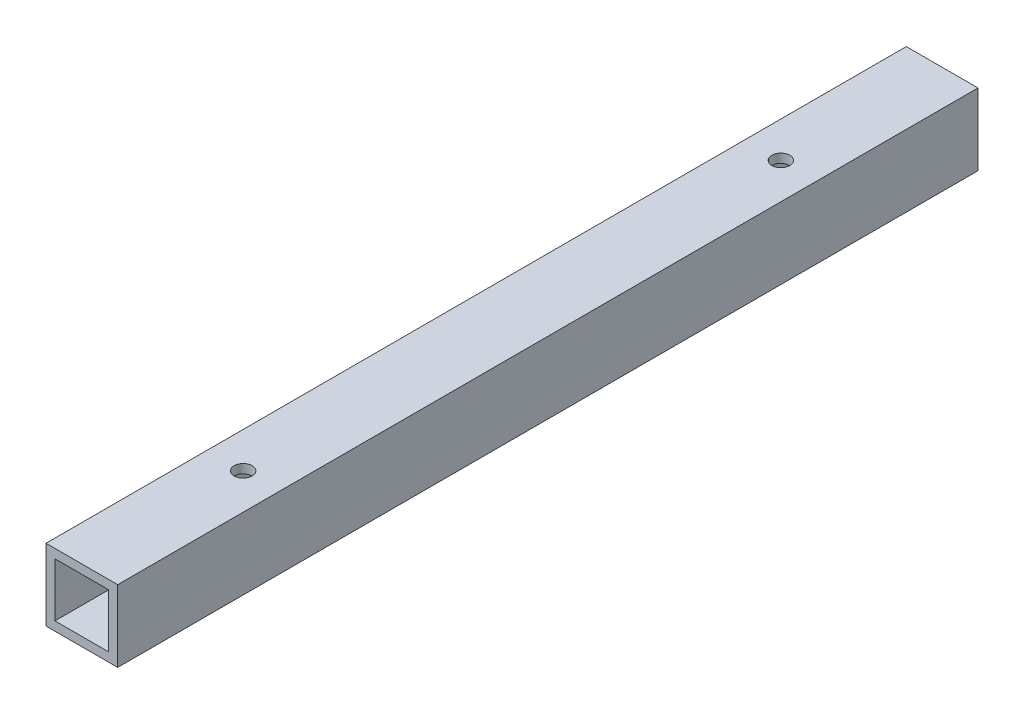
ISO-10303-21;
HEADER;
FILE_DESCRIPTION(('STEP AP214'),'2;1');
FILE_NAME('part.step','',(''),(''),'','','');
FILE_SCHEMA(('AUTOMOTIVE_DESIGN { 1 0 10303 214 1 1 1 1 }'));
ENDSEC;
DATA;
#1=APPLICATION_CONTEXT('core data for automotive mechanical design processes');
#2=APPLICATION_PROTOCOL_DEFINITION('international standard','automotive_design',2000,#1);
#3=PRODUCT_CONTEXT('',#1,'mechanical');
#4=PRODUCT('Part','Part','',(#3));
#5=PRODUCT_RELATED_PRODUCT_CATEGORY('part','',(#4));
#6=PRODUCT_DEFINITION_FORMATION('','',#4);
#7=PRODUCT_DEFINITION_CONTEXT('part definition',#1,'design');
#8=PRODUCT_DEFINITION('design','',#6,#7);
#9=PRODUCT_DEFINITION_SHAPE('','',#8);
#10=(LENGTH_UNIT() NAMED_UNIT(*) SI_UNIT(.MILLI.,.METRE.));
#11=(NAMED_UNIT(*) PLANE_ANGLE_UNIT() SI_UNIT($,.RADIAN.));
#12=(NAMED_UNIT(*) SI_UNIT($,.STERADIAN.) SOLID_ANGLE_UNIT());
#13=UNCERTAINTY_MEASURE_WITH_UNIT(LENGTH_MEASURE(1.E-05),#10,'distance_accuracy_value','');
#14=(GEOMETRIC_REPRESENTATION_CONTEXT(3) GLOBAL_UNCERTAINTY_ASSIGNED_CONTEXT((#13)) GLOBAL_UNIT_ASSIGNED_CONTEXT((#10,
#11,#12)) REPRESENTATION_CONTEXT('',''));
#15=CARTESIAN_POINT('',(0.,0.,0.));
#16=DIRECTION('',(0.,0.,1.));
#17=DIRECTION('',(1.,0.,0.));
#18=AXIS2_PLACEMENT_3D('',#15,#16,#17);
#19=CARTESIAN_POINT('',(0.,0.,152.4));
#20=DIRECTION('',(0.,0.,1.));
#21=DIRECTION('',(1.,0.,0.));
#22=AXIS2_PLACEMENT_3D('',#19,#20,#21);
#23=PLANE('',#22);
#24=DIRECTION('',(0.,-1.,0.));
#25=VECTOR('',#24,1.);
#26=CARTESIAN_POINT('',(-12.7,-12.7,152.4));
#27=LINE('',#26,#25);
#28=CARTESIAN_POINT('',(-12.7,12.7,152.4));
#29=VERTEX_POINT('',#28);
#30=CARTESIAN_POINT('',(-12.7,-12.7,152.4));
#31=VERTEX_POINT('',#30);
#32=EDGE_CURVE('E119',#29,#31,#27,.T.);
#33=ORIENTED_EDGE('',*,*,#32,.T.);
#34=DIRECTION('',(1.,0.,0.));
#35=VECTOR('',#34,1.);
#36=CARTESIAN_POINT('',(12.7,-12.7,152.4));
#37=LINE('',#36,#35);
#38=CARTESIAN_POINT('',(12.7,-12.7,152.4));
#39=VERTEX_POINT('',#38);
#40=EDGE_CURVE('E183',#31,#39,#37,.T.);
#41=ORIENTED_EDGE('',*,*,#40,.T.);
#42=DIRECTION('',(0.,1.,0.));
#43=VECTOR('',#42,1.);
#44=CARTESIAN_POINT('',(12.7,-12.7,152.4));
#45=LINE('',#44,#43);
#46=CARTESIAN_POINT('',(12.7,12.7,152.4));
#47=VERTEX_POINT('',#46);
#48=EDGE_CURVE('E186',#39,#47,#45,.T.);
#49=ORIENTED_EDGE('',*,*,#48,.T.);
#50=DIRECTION('',(-1.,0.,0.));
#51=VECTOR('',#50,1.);
#52=CARTESIAN_POINT('',(12.7,12.7,152.4));
#53=LINE('',#52,#51);
#54=EDGE_CURVE('E65',#47,#29,#53,.T.);
#55=ORIENTED_EDGE('',*,*,#54,.T.);
#56=EDGE_LOOP('',(#33,#41,#49,#55));
#57=FACE_BOUND('',#56,.T.);
#58=DIRECTION('',(1.,0.,0.));
#59=VECTOR('',#58,1.);
#60=CARTESIAN_POINT('',(9.525,-9.525,152.4));
#61=LINE('',#60,#59);
#62=CARTESIAN_POINT('',(-9.52499999999999,-9.525,152.4));
#63=VERTEX_POINT('',#62);
#64=CARTESIAN_POINT('',(9.525,-9.525,152.4));
#65=VERTEX_POINT('',#64);
#66=EDGE_CURVE('E165',#63,#65,#61,.T.);
#67=ORIENTED_EDGE('',*,*,#66,.F.);
#68=DIRECTION('',(0.,-1.,0.));
#69=VECTOR('',#68,1.);
#70=CARTESIAN_POINT('',(-9.52499999999999,-9.525,152.4));
#71=LINE('',#70,#69);
#72=CARTESIAN_POINT('',(-9.52499999999999,9.525,152.4));
#73=VERTEX_POINT('',#72);
#74=EDGE_CURVE('E115',#73,#63,#71,.T.);
#75=ORIENTED_EDGE('',*,*,#74,.F.);
#76=DIRECTION('',(-1.,0.,0.));
#77=VECTOR('',#76,1.);
#78=CARTESIAN_POINT('',(9.525,9.525,152.4));
#79=LINE('',#78,#77);
#80=CARTESIAN_POINT('',(9.525,9.525,152.4));
#81=VERTEX_POINT('',#80);
#82=EDGE_CURVE('E171',#81,#73,#79,.T.);
#83=ORIENTED_EDGE('',*,*,#82,.F.);
#84=DIRECTION('',(0.,1.,0.));
#85=VECTOR('',#84,1.);
#86=CARTESIAN_POINT('',(9.525,-9.525,152.4));
#87=LINE('',#86,#85);
#88=EDGE_CURVE('E168',#65,#81,#87,.T.);
#89=ORIENTED_EDGE('',*,*,#88,.F.);
#90=EDGE_LOOP('',(#67,#75,#83,#89));
#91=FACE_BOUND('',#90,.T.);
#92=ADVANCED_FACE('F39',(#57,#91),#23,.T.);
#93=CARTESIAN_POINT('',(-12.7,-12.7,152.4));
#94=DIRECTION('',(1.,0.,0.));
#95=DIRECTION('',(0.,0.,-1.));
#96=AXIS2_PLACEMENT_3D('',#93,#94,#95);
#97=PLANE('',#96);
#98=DIRECTION('',(0.,0.,-1.));
#99=VECTOR('',#98,1.);
#100=CARTESIAN_POINT('',(-12.7,12.7,152.4));
#101=LINE('',#100,#99);
#102=CARTESIAN_POINT('',(-12.7,12.7,-152.4));
#103=VERTEX_POINT('',#102);
#104=EDGE_CURVE('E191',#29,#103,#101,.T.);
#105=ORIENTED_EDGE('',*,*,#104,.T.);
#106=DIRECTION('',(0.,-1.,0.));
#107=VECTOR('',#106,1.);
#108=CARTESIAN_POINT('',(-12.7,-12.7,-152.4));
#109=LINE('',#108,#107);
#110=CARTESIAN_POINT('',(-12.7,-12.7,-152.4));
#111=VERTEX_POINT('',#110);
#112=EDGE_CURVE('E147',#103,#111,#109,.T.);
#113=ORIENTED_EDGE('',*,*,#112,.T.);
#114=DIRECTION('',(0.,0.,-1.));
#115=VECTOR('',#114,1.);
#116=CARTESIAN_POINT('',(-12.7,-12.7,152.4));
#117=LINE('',#116,#115);
#118=EDGE_CURVE('E11',#31,#111,#117,.T.);
#119=ORIENTED_EDGE('',*,*,#118,.F.);
#120=ORIENTED_EDGE('',*,*,#32,.F.);
#121=EDGE_LOOP('',(#105,#113,#119,#120));
#122=FACE_BOUND('',#121,.T.);
#123=ADVANCED_FACE('F41',(#122),#97,.F.);
#124=CARTESIAN_POINT('',(12.7,-12.7,152.4));
#125=DIRECTION('',(0.,1.,0.));
#126=DIRECTION('',(0.,0.,1.));
#127=AXIS2_PLACEMENT_3D('',#124,#125,#126);
#128=PLANE('',#127);
#129=CARTESIAN_POINT('',(0.,-12.7,95.25));
#130=DIRECTION('',(0.,1.,0.));
#131=DIRECTION('',(0.,0.,1.));
#132=AXIS2_PLACEMENT_3D('',#129,#130,#131);
#133=CIRCLE('',#132,3.175);
#134=CARTESIAN_POINT('',(0.,-12.7,98.425));
#135=VERTEX_POINT('',#134);
#136=EDGE_CURVE('E202',#135,#135,#133,.T.);
#137=ORIENTED_EDGE('',*,*,#136,.T.);
#138=EDGE_LOOP('',(#137));
#139=FACE_BOUND('',#138,.T.);
#140=CARTESIAN_POINT('',(0.,-12.7,-95.2499999999999));
#141=DIRECTION('',(0.,1.,0.));
#142=DIRECTION('',(0.,0.,-1.));
#143=AXIS2_PLACEMENT_3D('',#140,#141,#142);
#144=CIRCLE('',#143,3.175);
#145=CARTESIAN_POINT('',(0.,-12.7,-98.4249999999999));
#146=VERTEX_POINT('',#145);
#147=EDGE_CURVE('E215',#146,#146,#144,.T.);
#148=ORIENTED_EDGE('',*,*,#147,.T.);
#149=EDGE_LOOP('',(#148));
#150=FACE_BOUND('',#149,.T.);
#151=ORIENTED_EDGE('',*,*,#118,.T.);
#152=DIRECTION('',(1.,0.,0.));
#153=VECTOR('',#152,1.);
#154=CARTESIAN_POINT('',(12.7,-12.7,-152.4));
#155=LINE('',#154,#153);
#156=CARTESIAN_POINT('',(12.7,-12.7,-152.4));
#157=VERTEX_POINT('',#156);
#158=EDGE_CURVE('E151',#111,#157,#155,.T.);
#159=ORIENTED_EDGE('',*,*,#158,.T.);
#160=DIRECTION('',(0.,0.,-1.));
#161=VECTOR('',#160,1.);
#162=CARTESIAN_POINT('',(12.7,-12.7,152.4));
#163=LINE('',#162,#161);
#164=EDGE_CURVE('E49',#39,#157,#163,.T.);
#165=ORIENTED_EDGE('',*,*,#164,.F.);
#166=ORIENTED_EDGE('',*,*,#40,.F.);
#167=EDGE_LOOP('',(#151,#159,#165,#166));
#168=FACE_BOUND('',#167,.T.);
#169=ADVANCED_FACE('F247',(#139,#150,#168),#128,.F.);
#170=CARTESIAN_POINT('',(12.7,-12.7,152.4));
#171=DIRECTION('',(-1.,0.,0.));
#172=DIRECTION('',(0.,0.,1.));
#173=AXIS2_PLACEMENT_3D('',#170,#171,#172);
#174=PLANE('',#173);
#175=ORIENTED_EDGE('',*,*,#164,.T.);
#176=DIRECTION('',(0.,1.,0.));
#177=VECTOR('',#176,1.);
#178=CARTESIAN_POINT('',(12.7,-12.7,-152.4));
#179=LINE('',#178,#177);
#180=CARTESIAN_POINT('',(12.7,12.7,-152.4));
#181=VERTEX_POINT('',#180);
#182=EDGE_CURVE('E155',#157,#181,#179,.T.);
#183=ORIENTED_EDGE('',*,*,#182,.T.);
#184=DIRECTION('',(0.,0.,-1.));
#185=VECTOR('',#184,1.);
#186=CARTESIAN_POINT('',(12.7,12.7,152.4));
#187=LINE('',#186,#185);
#188=EDGE_CURVE('E194',#47,#181,#187,.T.);
#189=ORIENTED_EDGE('',*,*,#188,.F.);
#190=ORIENTED_EDGE('',*,*,#48,.F.);
#191=EDGE_LOOP('',(#175,#183,#189,#190));
#192=FACE_BOUND('',#191,.T.);
#193=ADVANCED_FACE('F231',(#192),#174,.F.);
#194=CARTESIAN_POINT('',(12.7,12.7,152.4));
#195=DIRECTION('',(0.,-1.,0.));
#196=DIRECTION('',(0.,0.,-1.));
#197=AXIS2_PLACEMENT_3D('',#194,#195,#196);
#198=PLANE('',#197);
#199=CARTESIAN_POINT('',(0.,12.7,95.25));
#200=DIRECTION('',(0.,1.,0.));
#201=DIRECTION('',(0.,0.,1.));
#202=AXIS2_PLACEMENT_3D('',#199,#200,#201);
#203=CIRCLE('',#202,3.175);
#204=CARTESIAN_POINT('',(0.,12.7,98.425));
#205=VERTEX_POINT('',#204);
#206=EDGE_CURVE('E209',#205,#205,#203,.T.);
#207=ORIENTED_EDGE('',*,*,#206,.F.);
#208=EDGE_LOOP('',(#207));
#209=FACE_BOUND('',#208,.T.);
#210=CARTESIAN_POINT('',(0.,12.7,-95.2499999999999));
#211=DIRECTION('',(0.,1.,0.));
#212=DIRECTION('',(0.,0.,-1.));
#213=AXIS2_PLACEMENT_3D('',#210,#211,#212);
#214=CIRCLE('',#213,3.175);
#215=CARTESIAN_POINT('',(0.,12.7,-98.4249999999999));
#216=VERTEX_POINT('',#215);
#217=EDGE_CURVE('E221',#216,#216,#214,.T.);
#218=ORIENTED_EDGE('',*,*,#217,.F.);
#219=EDGE_LOOP('',(#218));
#220=FACE_BOUND('',#219,.T.);
#221=ORIENTED_EDGE('',*,*,#188,.T.);
#222=DIRECTION('',(-1.,0.,0.));
#223=VECTOR('',#222,1.);
#224=CARTESIAN_POINT('',(12.7,12.7,-152.4));
#225=LINE('',#224,#223);
#226=EDGE_CURVE('E159',#181,#103,#225,.T.);
#227=ORIENTED_EDGE('',*,*,#226,.T.);
#228=ORIENTED_EDGE('',*,*,#104,.F.);
#229=ORIENTED_EDGE('',*,*,#54,.F.);
#230=EDGE_LOOP('',(#221,#227,#228,#229));
#231=FACE_BOUND('',#230,.T.);
#232=ADVANCED_FACE('F228',(#209,#220,#231),#198,.F.);
#233=CARTESIAN_POINT('',(-9.52499999999999,-9.525,152.4));
#234=DIRECTION('',(1.,0.,0.));
#235=DIRECTION('',(0.,0.,-1.));
#236=AXIS2_PLACEMENT_3D('',#233,#234,#235);
#237=PLANE('',#236);
#238=DIRECTION('',(0.,0.,-1.));
#239=VECTOR('',#238,1.);
#240=CARTESIAN_POINT('',(-9.52499999999999,-9.525,152.4));
#241=LINE('',#240,#239);
#242=CARTESIAN_POINT('',(-9.52499999999999,-9.525,-152.4));
#243=VERTEX_POINT('',#242);
#244=EDGE_CURVE('E107',#63,#243,#241,.T.);
#245=ORIENTED_EDGE('',*,*,#244,.T.);
#246=DIRECTION('',(0.,-1.,0.));
#247=VECTOR('',#246,1.);
#248=CARTESIAN_POINT('',(-9.52499999999999,-9.525,-152.4));
#249=LINE('',#248,#247);
#250=CARTESIAN_POINT('',(-9.52499999999999,9.525,-152.4));
#251=VERTEX_POINT('',#250);
#252=EDGE_CURVE('E112',#251,#243,#249,.T.);
#253=ORIENTED_EDGE('',*,*,#252,.F.);
#254=DIRECTION('',(0.,0.,-1.));
#255=VECTOR('',#254,1.);
#256=CARTESIAN_POINT('',(-9.52499999999999,9.525,152.4));
#257=LINE('',#256,#255);
#258=EDGE_CURVE('E174',#73,#251,#257,.T.);
#259=ORIENTED_EDGE('',*,*,#258,.F.);
#260=ORIENTED_EDGE('',*,*,#74,.T.);
#261=EDGE_LOOP('',(#245,#253,#259,#260));
#262=FACE_BOUND('',#261,.T.);
#263=ADVANCED_FACE('F109',(#262),#237,.T.);
#264=CARTESIAN_POINT('',(9.525,-9.525,152.4));
#265=DIRECTION('',(0.,1.,0.));
#266=DIRECTION('',(0.,0.,1.));
#267=AXIS2_PLACEMENT_3D('',#264,#265,#266);
#268=PLANE('',#267);
#269=CARTESIAN_POINT('',(0.,-9.525,95.25));
#270=DIRECTION('',(0.,1.,0.));
#271=DIRECTION('',(0.,0.,1.));
#272=AXIS2_PLACEMENT_3D('',#269,#270,#271);
#273=CIRCLE('',#272,3.175);
#274=CARTESIAN_POINT('',(0.,-9.525,98.425));
#275=VERTEX_POINT('',#274);
#276=EDGE_CURVE('E136',#275,#275,#273,.T.);
#277=ORIENTED_EDGE('',*,*,#276,.F.);
#278=EDGE_LOOP('',(#277));
#279=FACE_BOUND('',#278,.T.);
#280=CARTESIAN_POINT('',(0.,-9.525,-95.2499999999999));
#281=DIRECTION('',(0.,1.,0.));
#282=DIRECTION('',(0.,0.,1.));
#283=AXIS2_PLACEMENT_3D('',#280,#281,#282);
#284=CIRCLE('',#283,3.175);
#285=CARTESIAN_POINT('',(0.,-9.525,-92.0749999999999));
#286=VERTEX_POINT('',#285);
#287=EDGE_CURVE('E201',#286,#286,#284,.T.);
#288=ORIENTED_EDGE('',*,*,#287,.F.);
#289=EDGE_LOOP('',(#288));
#290=FACE_BOUND('',#289,.T.);
#291=DIRECTION('',(0.,0.,-1.));
#292=VECTOR('',#291,1.);
#293=CARTESIAN_POINT('',(9.525,-9.525,152.4));
#294=LINE('',#293,#292);
#295=CARTESIAN_POINT('',(9.525,-9.525,-152.4));
#296=VERTEX_POINT('',#295);
#297=EDGE_CURVE('E120',#65,#296,#294,.T.);
#298=ORIENTED_EDGE('',*,*,#297,.T.);
#299=DIRECTION('',(1.,0.,0.));
#300=VECTOR('',#299,1.);
#301=CARTESIAN_POINT('',(9.525,-9.525,-152.4));
#302=LINE('',#301,#300);
#303=EDGE_CURVE('E123',#243,#296,#302,.T.);
#304=ORIENTED_EDGE('',*,*,#303,.F.);
#305=ORIENTED_EDGE('',*,*,#244,.F.);
#306=ORIENTED_EDGE('',*,*,#66,.T.);
#307=EDGE_LOOP('',(#298,#304,#305,#306));
#308=FACE_BOUND('',#307,.T.);
#309=ADVANCED_FACE('F124',(#279,#290,#308),#268,.T.);
#310=CARTESIAN_POINT('',(9.525,-9.525,152.4));
#311=DIRECTION('',(-1.,0.,0.));
#312=DIRECTION('',(0.,0.,1.));
#313=AXIS2_PLACEMENT_3D('',#310,#311,#312);
#314=PLANE('',#313);
#315=DIRECTION('',(0.,0.,-1.));
#316=VECTOR('',#315,1.);
#317=CARTESIAN_POINT('',(9.525,9.525,152.4));
#318=LINE('',#317,#316);
#319=CARTESIAN_POINT('',(9.525,9.525,-152.4));
#320=VERTEX_POINT('',#319);
#321=EDGE_CURVE('E57',#81,#320,#318,.T.);
#322=ORIENTED_EDGE('',*,*,#321,.T.);
#323=DIRECTION('',(0.,1.,0.));
#324=VECTOR('',#323,1.);
#325=CARTESIAN_POINT('',(9.525,-9.525,-152.4));
#326=LINE('',#325,#324);
#327=EDGE_CURVE('E130',#296,#320,#326,.T.);
#328=ORIENTED_EDGE('',*,*,#327,.F.);
#329=ORIENTED_EDGE('',*,*,#297,.F.);
#330=ORIENTED_EDGE('',*,*,#88,.T.);
#331=EDGE_LOOP('',(#322,#328,#329,#330));
#332=FACE_BOUND('',#331,.T.);
#333=ADVANCED_FACE('F264',(#332),#314,.T.);
#334=CARTESIAN_POINT('',(9.525,9.525,152.4));
#335=DIRECTION('',(0.,-1.,0.));
#336=DIRECTION('',(0.,0.,-1.));
#337=AXIS2_PLACEMENT_3D('',#334,#335,#336);
#338=PLANE('',#337);
#339=CARTESIAN_POINT('',(0.,9.525,95.25));
#340=DIRECTION('',(0.,-1.,0.));
#341=DIRECTION('',(0.,0.,-1.));
#342=AXIS2_PLACEMENT_3D('',#339,#340,#341);
#343=CIRCLE('',#342,3.175);
#344=CARTESIAN_POINT('',(0.,9.525,92.075));
#345=VERTEX_POINT('',#344);
#346=EDGE_CURVE('E43',#345,#345,#343,.T.);
#347=ORIENTED_EDGE('',*,*,#346,.F.);
#348=EDGE_LOOP('',(#347));
#349=FACE_BOUND('',#348,.T.);
#350=CARTESIAN_POINT('',(0.,9.525,-95.2499999999999));
#351=DIRECTION('',(0.,-1.,0.));
#352=DIRECTION('',(0.,0.,-1.));
#353=AXIS2_PLACEMENT_3D('',#350,#351,#352);
#354=CIRCLE('',#353,3.175);
#355=CARTESIAN_POINT('',(0.,9.525,-98.4249999999999));
#356=VERTEX_POINT('',#355);
#357=EDGE_CURVE('E198',#356,#356,#354,.T.);
#358=ORIENTED_EDGE('',*,*,#357,.F.);
#359=EDGE_LOOP('',(#358));
#360=FACE_BOUND('',#359,.T.);
#361=ORIENTED_EDGE('',*,*,#258,.T.);
#362=DIRECTION('',(-1.,0.,0.));
#363=VECTOR('',#362,1.);
#364=CARTESIAN_POINT('',(9.525,9.525,-152.4));
#365=LINE('',#364,#363);
#366=EDGE_CURVE('E134',#320,#251,#365,.T.);
#367=ORIENTED_EDGE('',*,*,#366,.F.);
#368=ORIENTED_EDGE('',*,*,#321,.F.);
#369=ORIENTED_EDGE('',*,*,#82,.T.);
#370=EDGE_LOOP('',(#361,#367,#368,#369));
#371=FACE_BOUND('',#370,.T.);
#372=ADVANCED_FACE('F268',(#349,#360,#371),#338,.T.);
#373=CARTESIAN_POINT('',(0.,0.,-152.4));
#374=DIRECTION('',(0.,0.,1.));
#375=DIRECTION('',(1.,0.,0.));
#376=AXIS2_PLACEMENT_3D('',#373,#374,#375);
#377=PLANE('',#376);
#378=ORIENTED_EDGE('',*,*,#366,.T.);
#379=ORIENTED_EDGE('',*,*,#252,.T.);
#380=ORIENTED_EDGE('',*,*,#303,.T.);
#381=ORIENTED_EDGE('',*,*,#327,.T.);
#382=EDGE_LOOP('',(#378,#379,#380,#381));
#383=FACE_BOUND('',#382,.T.);
#384=ORIENTED_EDGE('',*,*,#112,.F.);
#385=ORIENTED_EDGE('',*,*,#226,.F.);
#386=ORIENTED_EDGE('',*,*,#182,.F.);
#387=ORIENTED_EDGE('',*,*,#158,.F.);
#388=EDGE_LOOP('',(#384,#385,#386,#387));
#389=FACE_BOUND('',#388,.T.);
#390=ADVANCED_FACE('F132',(#383,#389),#377,.F.);
#391=CARTESIAN_POINT('',(0.,-12.7,-95.2499999999999));
#392=DIRECTION('',(0.,1.,0.));
#393=DIRECTION('',(0.,0.,1.));
#394=AXIS2_PLACEMENT_3D('',#391,#392,#393);
#395=CYLINDRICAL_SURFACE('',#394,3.175);
#396=ORIENTED_EDGE('',*,*,#357,.T.);
#397=EDGE_LOOP('',(#396));
#398=FACE_BOUND('',#397,.T.);
#399=ORIENTED_EDGE('',*,*,#217,.T.);
#400=EDGE_LOOP('',(#399));
#401=FACE_BOUND('',#400,.T.);
#402=ADVANCED_FACE('F226',(#398,#401),#395,.F.);
#403=CARTESIAN_POINT('',(0.,-12.7,95.25));
#404=DIRECTION('',(0.,1.,0.));
#405=DIRECTION('',(0.,0.,1.));
#406=AXIS2_PLACEMENT_3D('',#403,#404,#405);
#407=CYLINDRICAL_SURFACE('',#406,3.175);
#408=ORIENTED_EDGE('',*,*,#346,.T.);
#409=EDGE_LOOP('',(#408));
#410=FACE_BOUND('',#409,.T.);
#411=ORIENTED_EDGE('',*,*,#206,.T.);
#412=EDGE_LOOP('',(#411));
#413=FACE_BOUND('',#412,.T.);
#414=ADVANCED_FACE('F277',(#410,#413),#407,.F.);
#415=ORIENTED_EDGE('',*,*,#287,.T.);
#416=EDGE_LOOP('',(#415));
#417=FACE_BOUND('',#416,.T.);
#418=ORIENTED_EDGE('',*,*,#147,.F.);
#419=EDGE_LOOP('',(#418));
#420=FACE_BOUND('',#419,.T.);
#421=ADVANCED_FACE('F278',(#417,#420),#395,.F.);
#422=ORIENTED_EDGE('',*,*,#276,.T.);
#423=EDGE_LOOP('',(#422));
#424=FACE_BOUND('',#423,.T.);
#425=ORIENTED_EDGE('',*,*,#136,.F.);
#426=EDGE_LOOP('',(#425));
#427=FACE_BOUND('',#426,.T.);
#428=ADVANCED_FACE('F281',(#424,#427),#407,.F.);
#429=CLOSED_SHELL('',(#92,#123,#169,#193,#232,#263,#309,#333,#372,#390,#402,#414,#421,#428));
#430=MANIFOLD_SOLID_BREP('B2',#429);
#431=ADVANCED_BREP_SHAPE_REPRESENTATION('',(#18,#430),#14);
#432=SHAPE_DEFINITION_REPRESENTATION(#9,#431);
ENDSEC;
END-ISO-10303-21;
